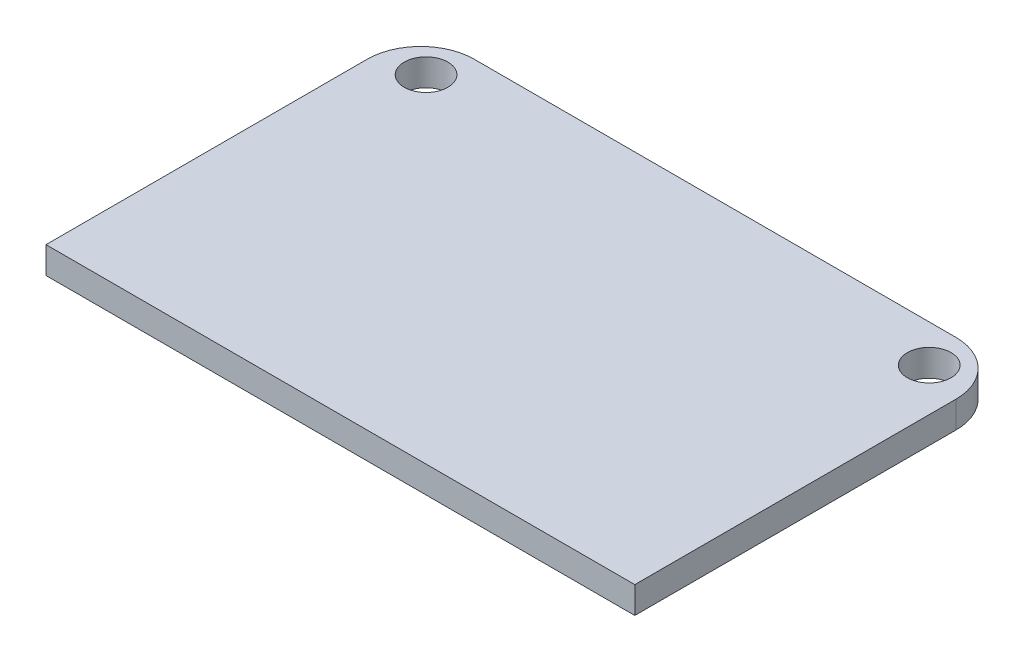
ISO-10303-21;
HEADER;
FILE_DESCRIPTION(('STEP AP214'),'2;1');
FILE_NAME('part.step','',(''),(''),'','','');
FILE_SCHEMA(('AUTOMOTIVE_DESIGN { 1 0 10303 214 1 1 1 1 }'));
ENDSEC;
DATA;
#1=APPLICATION_CONTEXT('core data for automotive mechanical design processes');
#2=APPLICATION_PROTOCOL_DEFINITION('international standard','automotive_design',2000,#1);
#3=PRODUCT_CONTEXT('',#1,'mechanical');
#4=PRODUCT('Part','Part','',(#3));
#5=PRODUCT_RELATED_PRODUCT_CATEGORY('part','',(#4));
#6=PRODUCT_DEFINITION_FORMATION('','',#4);
#7=PRODUCT_DEFINITION_CONTEXT('part definition',#1,'design');
#8=PRODUCT_DEFINITION('design','',#6,#7);
#9=PRODUCT_DEFINITION_SHAPE('','',#8);
#10=(LENGTH_UNIT() NAMED_UNIT(*) SI_UNIT(.MILLI.,.METRE.));
#11=(NAMED_UNIT(*) PLANE_ANGLE_UNIT() SI_UNIT($,.RADIAN.));
#12=(NAMED_UNIT(*) SI_UNIT($,.STERADIAN.) SOLID_ANGLE_UNIT());
#13=UNCERTAINTY_MEASURE_WITH_UNIT(LENGTH_MEASURE(1.E-05),#10,'distance_accuracy_value','');
#14=(GEOMETRIC_REPRESENTATION_CONTEXT(3) GLOBAL_UNCERTAINTY_ASSIGNED_CONTEXT((#13)) GLOBAL_UNIT_ASSIGNED_CONTEXT((#10,
#11,#12)) REPRESENTATION_CONTEXT('',''));
#15=CARTESIAN_POINT('',(0.,0.,0.));
#16=DIRECTION('',(0.,0.,1.));
#17=DIRECTION('',(1.,0.,0.));
#18=AXIS2_PLACEMENT_3D('',#15,#16,#17);
#19=CARTESIAN_POINT('',(34.925,3.175,22.225));
#20=DIRECTION('',(-1.,0.,0.));
#21=DIRECTION('',(0.,0.,1.));
#22=AXIS2_PLACEMENT_3D('',#19,#20,#21);
#23=PLANE('',#22);
#24=DIRECTION('',(0.,0.,-1.));
#25=VECTOR('',#24,1.);
#26=CARTESIAN_POINT('',(34.925,0.,22.225));
#27=LINE('',#26,#25);
#28=CARTESIAN_POINT('',(34.925,0.,22.225));
#29=VERTEX_POINT('',#28);
#30=CARTESIAN_POINT('',(34.925,0.,-15.875));
#31=VERTEX_POINT('',#30);
#32=EDGE_CURVE('E126',#29,#31,#27,.T.);
#33=ORIENTED_EDGE('',*,*,#32,.T.);
#34=DIRECTION('',(0.,-1.,0.));
#35=VECTOR('',#34,1.);
#36=CARTESIAN_POINT('',(34.925,3.175,-15.875));
#37=LINE('',#36,#35);
#38=CARTESIAN_POINT('',(34.925,3.175,-15.875));
#39=VERTEX_POINT('',#38);
#40=EDGE_CURVE('E11',#31,#39,#37,.F.);
#41=ORIENTED_EDGE('',*,*,#40,.T.);
#42=DIRECTION('',(0.,0.,-1.));
#43=VECTOR('',#42,1.);
#44=CARTESIAN_POINT('',(34.925,3.175,22.225));
#45=LINE('',#44,#43);
#46=CARTESIAN_POINT('',(34.925,3.175,22.225));
#47=VERTEX_POINT('',#46);
#48=EDGE_CURVE('E137',#47,#39,#45,.T.);
#49=ORIENTED_EDGE('',*,*,#48,.F.);
#50=DIRECTION('',(0.,-1.,0.));
#51=VECTOR('',#50,1.);
#52=CARTESIAN_POINT('',(34.925,3.175,22.225));
#53=LINE('',#52,#51);
#54=EDGE_CURVE('E116',#47,#29,#53,.T.);
#55=ORIENTED_EDGE('',*,*,#54,.T.);
#56=EDGE_LOOP('',(#33,#41,#49,#55));
#57=FACE_BOUND('',#56,.T.);
#58=ADVANCED_FACE('F39',(#57),#23,.F.);
#59=CARTESIAN_POINT('',(-34.925,3.175,-22.225));
#60=DIRECTION('',(0.,0.,1.));
#61=DIRECTION('',(1.,0.,0.));
#62=AXIS2_PLACEMENT_3D('',#59,#60,#61);
#63=PLANE('',#62);
#64=DIRECTION('',(-1.,0.,0.));
#65=VECTOR('',#64,1.);
#66=CARTESIAN_POINT('',(-34.925,0.,-22.225));
#67=LINE('',#66,#65);
#68=CARTESIAN_POINT('',(28.575,0.,-22.225));
#69=VERTEX_POINT('',#68);
#70=CARTESIAN_POINT('',(-28.575,0.,-22.225));
#71=VERTEX_POINT('',#70);
#72=EDGE_CURVE('E129',#69,#71,#67,.T.);
#73=ORIENTED_EDGE('',*,*,#72,.T.);
#74=DIRECTION('',(0.,-1.,0.));
#75=VECTOR('',#74,1.);
#76=CARTESIAN_POINT('',(-28.575,3.175,-22.225));
#77=LINE('',#76,#75);
#78=CARTESIAN_POINT('',(-28.575,3.175,-22.225));
#79=VERTEX_POINT('',#78);
#80=EDGE_CURVE('E61',#71,#79,#77,.F.);
#81=ORIENTED_EDGE('',*,*,#80,.T.);
#82=DIRECTION('',(-1.,0.,0.));
#83=VECTOR('',#82,1.);
#84=CARTESIAN_POINT('',(-34.925,3.175,-22.225));
#85=LINE('',#84,#83);
#86=CARTESIAN_POINT('',(28.575,3.175,-22.225));
#87=VERTEX_POINT('',#86);
#88=EDGE_CURVE('E105',#87,#79,#85,.T.);
#89=ORIENTED_EDGE('',*,*,#88,.F.);
#90=DIRECTION('',(0.,-1.,0.));
#91=VECTOR('',#90,1.);
#92=CARTESIAN_POINT('',(28.575,3.175,-22.225));
#93=LINE('',#92,#91);
#94=EDGE_CURVE('E147',#87,#69,#93,.T.);
#95=ORIENTED_EDGE('',*,*,#94,.T.);
#96=EDGE_LOOP('',(#73,#81,#89,#95));
#97=FACE_BOUND('',#96,.T.);
#98=ADVANCED_FACE('F159',(#97),#63,.F.);
#99=CARTESIAN_POINT('',(-34.925,3.175,22.225));
#100=DIRECTION('',(1.,0.,0.));
#101=DIRECTION('',(0.,0.,-1.));
#102=AXIS2_PLACEMENT_3D('',#99,#100,#101);
#103=PLANE('',#102);
#104=DIRECTION('',(0.,0.,1.));
#105=VECTOR('',#104,1.);
#106=CARTESIAN_POINT('',(-34.925,3.175,22.225));
#107=LINE('',#106,#105);
#108=CARTESIAN_POINT('',(-34.925,3.175,-15.875));
#109=VERTEX_POINT('',#108);
#110=CARTESIAN_POINT('',(-34.925,3.175,22.225));
#111=VERTEX_POINT('',#110);
#112=EDGE_CURVE('E94',#109,#111,#107,.T.);
#113=ORIENTED_EDGE('',*,*,#112,.F.);
#114=DIRECTION('',(0.,-1.,0.));
#115=VECTOR('',#114,1.);
#116=CARTESIAN_POINT('',(-34.925,3.175,-15.875));
#117=LINE('',#116,#115);
#118=CARTESIAN_POINT('',(-34.925,0.,-15.875));
#119=VERTEX_POINT('',#118);
#120=EDGE_CURVE('E115',#109,#119,#117,.T.);
#121=ORIENTED_EDGE('',*,*,#120,.T.);
#122=DIRECTION('',(0.,0.,1.));
#123=VECTOR('',#122,1.);
#124=CARTESIAN_POINT('',(-34.925,0.,22.225));
#125=LINE('',#124,#123);
#126=CARTESIAN_POINT('',(-34.925,0.,22.225));
#127=VERTEX_POINT('',#126);
#128=EDGE_CURVE('E111',#119,#127,#125,.T.);
#129=ORIENTED_EDGE('',*,*,#128,.T.);
#130=DIRECTION('',(0.,-1.,0.));
#131=VECTOR('',#130,1.);
#132=CARTESIAN_POINT('',(-34.925,3.175,22.225));
#133=LINE('',#132,#131);
#134=EDGE_CURVE('E108',#111,#127,#133,.T.);
#135=ORIENTED_EDGE('',*,*,#134,.F.);
#136=EDGE_LOOP('',(#113,#121,#129,#135));
#137=FACE_BOUND('',#136,.T.);
#138=ADVANCED_FACE('F109',(#137),#103,.F.);
#139=CARTESIAN_POINT('',(-34.925,3.175,22.225));
#140=DIRECTION('',(0.,0.,-1.));
#141=DIRECTION('',(-1.,0.,0.));
#142=AXIS2_PLACEMENT_3D('',#139,#140,#141);
#143=PLANE('',#142);
#144=DIRECTION('',(1.,0.,0.));
#145=VECTOR('',#144,1.);
#146=CARTESIAN_POINT('',(-34.925,0.,22.225));
#147=LINE('',#146,#145);
#148=EDGE_CURVE('E135',#127,#29,#147,.T.);
#149=ORIENTED_EDGE('',*,*,#148,.T.);
#150=ORIENTED_EDGE('',*,*,#54,.F.);
#151=DIRECTION('',(1.,0.,0.));
#152=VECTOR('',#151,1.);
#153=CARTESIAN_POINT('',(-34.925,3.175,22.225));
#154=LINE('',#153,#152);
#155=EDGE_CURVE('E98',#111,#47,#154,.T.);
#156=ORIENTED_EDGE('',*,*,#155,.F.);
#157=ORIENTED_EDGE('',*,*,#134,.T.);
#158=EDGE_LOOP('',(#149,#150,#156,#157));
#159=FACE_BOUND('',#158,.T.);
#160=ADVANCED_FACE('F118',(#159),#143,.F.);
#161=CARTESIAN_POINT('',(0.,3.175,0.));
#162=DIRECTION('',(0.,-1.,0.));
#163=DIRECTION('',(0.,0.,-1.));
#164=AXIS2_PLACEMENT_3D('',#161,#162,#163);
#165=PLANE('',#164);
#166=CARTESIAN_POINT('',(29.845,3.175,-17.78));
#167=DIRECTION('',(0.,-1.,0.));
#168=DIRECTION('',(0.,0.,-1.));
#169=AXIS2_PLACEMENT_3D('',#166,#167,#168);
#170=CIRCLE('',#169,2.59079999999999);
#171=CARTESIAN_POINT('',(29.845,3.175,-20.3708));
#172=VERTEX_POINT('',#171);
#173=EDGE_CURVE('E175',#172,#172,#170,.T.);
#174=ORIENTED_EDGE('',*,*,#173,.T.);
#175=EDGE_LOOP('',(#174));
#176=FACE_BOUND('',#175,.T.);
#177=CARTESIAN_POINT('',(-29.845,3.175,-17.78));
#178=DIRECTION('',(0.,-1.,0.));
#179=DIRECTION('',(0.,0.,-1.));
#180=AXIS2_PLACEMENT_3D('',#177,#178,#179);
#181=CIRCLE('',#180,2.59079999999999);
#182=CARTESIAN_POINT('',(-29.845,3.175,-20.3708));
#183=VERTEX_POINT('',#182);
#184=EDGE_CURVE('E130',#183,#183,#181,.T.);
#185=ORIENTED_EDGE('',*,*,#184,.T.);
#186=EDGE_LOOP('',(#185));
#187=FACE_BOUND('',#186,.T.);
#188=ORIENTED_EDGE('',*,*,#88,.T.);
#189=CARTESIAN_POINT('',(-28.575,3.175,-15.875));
#190=DIRECTION('',(0.,-1.,0.));
#191=DIRECTION('',(0.,0.,-1.));
#192=AXIS2_PLACEMENT_3D('',#189,#190,#191);
#193=CIRCLE('',#192,6.35);
#194=EDGE_CURVE('E48',#79,#109,#193,.F.);
#195=ORIENTED_EDGE('',*,*,#194,.T.);
#196=ORIENTED_EDGE('',*,*,#112,.T.);
#197=ORIENTED_EDGE('',*,*,#155,.T.);
#198=ORIENTED_EDGE('',*,*,#48,.T.);
#199=CARTESIAN_POINT('',(28.575,3.175,-15.875));
#200=DIRECTION('',(0.,-1.,0.));
#201=DIRECTION('',(0.,0.,-1.));
#202=AXIS2_PLACEMENT_3D('',#199,#200,#201);
#203=CIRCLE('',#202,6.35);
#204=EDGE_CURVE('E153',#39,#87,#203,.F.);
#205=ORIENTED_EDGE('',*,*,#204,.T.);
#206=EDGE_LOOP('',(#188,#195,#196,#197,#198,#205));
#207=FACE_BOUND('',#206,.T.);
#208=ADVANCED_FACE('F96',(#176,#187,#207),#165,.F.);
#209=CARTESIAN_POINT('',(0.,0.,0.));
#210=DIRECTION('',(0.,-1.,0.));
#211=DIRECTION('',(0.,0.,-1.));
#212=AXIS2_PLACEMENT_3D('',#209,#210,#211);
#213=PLANE('',#212);
#214=CARTESIAN_POINT('',(29.845,0.,-17.78));
#215=DIRECTION('',(0.,-1.,0.));
#216=DIRECTION('',(0.,0.,-1.));
#217=AXIS2_PLACEMENT_3D('',#214,#215,#216);
#218=CIRCLE('',#217,2.59079999999999);
#219=CARTESIAN_POINT('',(29.845,0.,-20.3708));
#220=VERTEX_POINT('',#219);
#221=EDGE_CURVE('E179',#220,#220,#218,.T.);
#222=ORIENTED_EDGE('',*,*,#221,.F.);
#223=EDGE_LOOP('',(#222));
#224=FACE_BOUND('',#223,.T.);
#225=CARTESIAN_POINT('',(-29.845,0.,-17.78));
#226=DIRECTION('',(0.,-1.,0.));
#227=DIRECTION('',(0.,0.,-1.));
#228=AXIS2_PLACEMENT_3D('',#225,#226,#227);
#229=CIRCLE('',#228,2.59079999999999);
#230=CARTESIAN_POINT('',(-29.845,0.,-20.3708));
#231=VERTEX_POINT('',#230);
#232=EDGE_CURVE('E171',#231,#231,#229,.T.);
#233=ORIENTED_EDGE('',*,*,#232,.F.);
#234=EDGE_LOOP('',(#233));
#235=FACE_BOUND('',#234,.T.);
#236=ORIENTED_EDGE('',*,*,#128,.F.);
#237=CARTESIAN_POINT('',(-28.575,0.,-15.875));
#238=DIRECTION('',(0.,-1.,0.));
#239=DIRECTION('',(0.,0.,-1.));
#240=AXIS2_PLACEMENT_3D('',#237,#238,#239);
#241=CIRCLE('',#240,6.35);
#242=EDGE_CURVE('E144',#119,#71,#241,.T.);
#243=ORIENTED_EDGE('',*,*,#242,.T.);
#244=ORIENTED_EDGE('',*,*,#72,.F.);
#245=CARTESIAN_POINT('',(28.575,0.,-15.875));
#246=DIRECTION('',(0.,-1.,0.));
#247=DIRECTION('',(0.,0.,-1.));
#248=AXIS2_PLACEMENT_3D('',#245,#246,#247);
#249=CIRCLE('',#248,6.35);
#250=EDGE_CURVE('E141',#69,#31,#249,.T.);
#251=ORIENTED_EDGE('',*,*,#250,.T.);
#252=ORIENTED_EDGE('',*,*,#32,.F.);
#253=ORIENTED_EDGE('',*,*,#148,.F.);
#254=EDGE_LOOP('',(#236,#243,#244,#251,#252,#253));
#255=FACE_BOUND('',#254,.T.);
#256=ADVANCED_FACE('F164',(#224,#235,#255),#213,.T.);
#257=CARTESIAN_POINT('',(-28.575,3.175,-15.875));
#258=DIRECTION('',(0.,-1.,0.));
#259=DIRECTION('',(0.,0.,-1.));
#260=AXIS2_PLACEMENT_3D('',#257,#258,#259);
#261=CYLINDRICAL_SURFACE('',#260,6.35);
#262=ORIENTED_EDGE('',*,*,#194,.F.);
#263=ORIENTED_EDGE('',*,*,#80,.F.);
#264=ORIENTED_EDGE('',*,*,#242,.F.);
#265=ORIENTED_EDGE('',*,*,#120,.F.);
#266=EDGE_LOOP('',(#262,#263,#264,#265));
#267=FACE_BOUND('',#266,.T.);
#268=ADVANCED_FACE('F189',(#267),#261,.T.);
#269=CARTESIAN_POINT('',(28.575,3.175,-15.875));
#270=DIRECTION('',(0.,-1.,0.));
#271=DIRECTION('',(0.,0.,-1.));
#272=AXIS2_PLACEMENT_3D('',#269,#270,#271);
#273=CYLINDRICAL_SURFACE('',#272,6.35);
#274=ORIENTED_EDGE('',*,*,#204,.F.);
#275=ORIENTED_EDGE('',*,*,#40,.F.);
#276=ORIENTED_EDGE('',*,*,#250,.F.);
#277=ORIENTED_EDGE('',*,*,#94,.F.);
#278=EDGE_LOOP('',(#274,#275,#276,#277));
#279=FACE_BOUND('',#278,.T.);
#280=ADVANCED_FACE('F41',(#279),#273,.T.);
#281=CARTESIAN_POINT('',(-29.845,0.,-17.78));
#282=DIRECTION('',(0.,-1.,0.));
#283=DIRECTION('',(0.,0.,-1.));
#284=AXIS2_PLACEMENT_3D('',#281,#282,#283);
#285=CYLINDRICAL_SURFACE('',#284,2.59079999999999);
#286=ORIENTED_EDGE('',*,*,#232,.T.);
#287=EDGE_LOOP('',(#286));
#288=FACE_BOUND('',#287,.T.);
#289=ORIENTED_EDGE('',*,*,#184,.F.);
#290=EDGE_LOOP('',(#289));
#291=FACE_BOUND('',#290,.T.);
#292=ADVANCED_FACE('F193',(#288,#291),#285,.F.);
#293=CARTESIAN_POINT('',(29.845,0.,-17.78));
#294=DIRECTION('',(0.,-1.,0.));
#295=DIRECTION('',(0.,0.,-1.));
#296=AXIS2_PLACEMENT_3D('',#293,#294,#295);
#297=CYLINDRICAL_SURFACE('',#296,2.59079999999999);
#298=ORIENTED_EDGE('',*,*,#221,.T.);
#299=EDGE_LOOP('',(#298));
#300=FACE_BOUND('',#299,.T.);
#301=ORIENTED_EDGE('',*,*,#173,.F.);
#302=EDGE_LOOP('',(#301));
#303=FACE_BOUND('',#302,.T.);
#304=ADVANCED_FACE('F184',(#300,#303),#297,.F.);
#305=CLOSED_SHELL('',(#58,#98,#138,#160,#208,#256,#268,#280,#292,#304));
#306=MANIFOLD_SOLID_BREP('B2',#305);
#307=ADVANCED_BREP_SHAPE_REPRESENTATION('',(#18,#306),#14);
#308=SHAPE_DEFINITION_REPRESENTATION(#9,#307);
ENDSEC;
END-ISO-10303-21;
